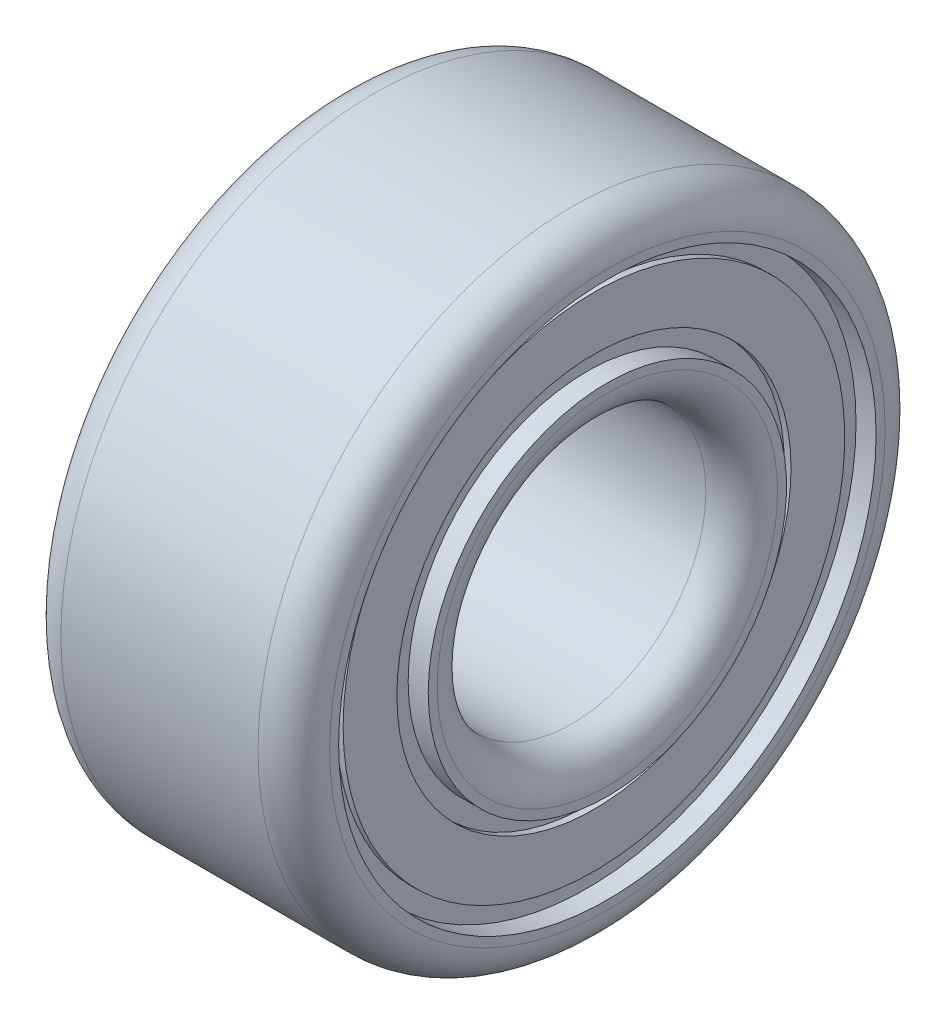
ISO-10303-21;
HEADER;
FILE_DESCRIPTION(('STEP AP214'),'2;1');
FILE_NAME('part.step','',(''),(''),'','','');
FILE_SCHEMA(('AUTOMOTIVE_DESIGN { 1 0 10303 214 1 1 1 1 }'));
ENDSEC;
DATA;
#1=APPLICATION_CONTEXT('core data for automotive mechanical design processes');
#2=APPLICATION_PROTOCOL_DEFINITION('international standard','automotive_design',2000,#1);
#3=PRODUCT_CONTEXT('',#1,'mechanical');
#4=PRODUCT('Part','Part','',(#3));
#5=PRODUCT_RELATED_PRODUCT_CATEGORY('part','',(#4));
#6=PRODUCT_DEFINITION_FORMATION('','',#4);
#7=PRODUCT_DEFINITION_CONTEXT('part definition',#1,'design');
#8=PRODUCT_DEFINITION('design','',#6,#7);
#9=PRODUCT_DEFINITION_SHAPE('','',#8);
#10=(LENGTH_UNIT() NAMED_UNIT(*) SI_UNIT(.MILLI.,.METRE.));
#11=(NAMED_UNIT(*) PLANE_ANGLE_UNIT() SI_UNIT($,.RADIAN.));
#12=(NAMED_UNIT(*) SI_UNIT($,.STERADIAN.) SOLID_ANGLE_UNIT());
#13=UNCERTAINTY_MEASURE_WITH_UNIT(LENGTH_MEASURE(1.E-05),#10,'distance_accuracy_value','');
#14=(GEOMETRIC_REPRESENTATION_CONTEXT(3) GLOBAL_UNCERTAINTY_ASSIGNED_CONTEXT((#13)) GLOBAL_UNIT_ASSIGNED_CONTEXT((#10,
#11,#12)) REPRESENTATION_CONTEXT('',''));
#15=CARTESIAN_POINT('',(0.,0.,0.));
#16=DIRECTION('',(0.,0.,1.));
#17=DIRECTION('',(1.,0.,0.));
#18=AXIS2_PLACEMENT_3D('',#15,#16,#17);
#19=CARTESIAN_POINT('',(-7.41933259282832,0.,0.));
#20=DIRECTION('',(-1.,0.,0.));
#21=DIRECTION('',(0.,0.,1.));
#22=AXIS2_PLACEMENT_3D('',#19,#20,#21);
#23=CYLINDRICAL_SURFACE('',#22,1.5);
#24=CARTESIAN_POINT('',(0.878365864553343,0.,0.));
#25=DIRECTION('',(-1.,0.,0.));
#26=DIRECTION('',(0.,0.,1.));
#27=AXIS2_PLACEMENT_3D('',#24,#25,#26);
#28=CIRCLE('',#27,1.5);
#29=CARTESIAN_POINT('',(0.878365864553343,0.,1.5));
#30=VERTEX_POINT('',#29);
#31=EDGE_CURVE('E507',#30,#30,#28,.T.);
#32=ORIENTED_EDGE('',*,*,#31,.F.);
#33=EDGE_LOOP('',(#32));
#34=FACE_BOUND('',#33,.T.);
#35=CARTESIAN_POINT('',(-1.32163413544666,0.,0.));
#36=DIRECTION('',(1.,0.,0.));
#37=DIRECTION('',(0.,0.,-1.));
#38=AXIS2_PLACEMENT_3D('',#35,#36,#37);
#39=CIRCLE('',#38,1.5);
#40=CARTESIAN_POINT('',(-1.32163413544666,0.,-1.5));
#41=VERTEX_POINT('',#40);
#42=EDGE_CURVE('E64',#41,#41,#39,.T.);
#43=ORIENTED_EDGE('',*,*,#42,.F.);
#44=EDGE_LOOP('',(#43));
#45=FACE_BOUND('',#44,.T.);
#46=ADVANCED_FACE('F17',(#34,#45),#23,.F.);
#47=CARTESIAN_POINT('',(0.878365864553343,0.,0.));
#48=DIRECTION('',(-1.,0.,0.));
#49=DIRECTION('',(0.,0.,1.));
#50=AXIS2_PLACEMENT_3D('',#47,#48,#49);
#51=TOROIDAL_SURFACE('',#50,1.9,0.4);
#52=CARTESIAN_POINT('',(1.27836586455334,0.,0.));
#53=DIRECTION('',(1.,0.,0.));
#54=DIRECTION('',(0.,0.,1.));
#55=AXIS2_PLACEMENT_3D('',#52,#53,#54);
#56=CIRCLE('',#55,1.9);
#57=CARTESIAN_POINT('',(1.27836586455334,0.,1.9));
#58=VERTEX_POINT('',#57);
#59=CARTESIAN_POINT('',(1.27836586455334,0.,-1.9));
#60=VERTEX_POINT('',#59);
#61=EDGE_CURVE('E59',#58,#60,#56,.T.);
#62=ORIENTED_EDGE('',*,*,#61,.T.);
#63=CARTESIAN_POINT('',(1.27836586455334,0.,0.));
#64=DIRECTION('',(1.,0.,0.));
#65=DIRECTION('',(0.,0.,-1.));
#66=AXIS2_PLACEMENT_3D('',#63,#64,#65);
#67=CIRCLE('',#66,1.9);
#68=EDGE_CURVE('E56',#60,#58,#67,.T.);
#69=ORIENTED_EDGE('',*,*,#68,.T.);
#70=EDGE_LOOP('',(#62,#69));
#71=FACE_BOUND('',#70,.T.);
#72=ORIENTED_EDGE('',*,*,#31,.T.);
#73=EDGE_LOOP('',(#72));
#74=FACE_BOUND('',#73,.T.);
#75=ADVANCED_FACE('F60',(#71,#74),#51,.T.);
#76=CARTESIAN_POINT('',(-1.32163413544666,0.,0.));
#77=DIRECTION('',(1.,0.,0.));
#78=DIRECTION('',(0.,0.,-1.));
#79=AXIS2_PLACEMENT_3D('',#76,#77,#78);
#80=TOROIDAL_SURFACE('',#79,1.9,0.4);
#81=CARTESIAN_POINT('',(-1.72163413544666,0.,0.));
#82=DIRECTION('',(-1.,0.,0.));
#83=DIRECTION('',(0.,0.,-1.));
#84=AXIS2_PLACEMENT_3D('',#81,#82,#83);
#85=CIRCLE('',#84,1.9);
#86=CARTESIAN_POINT('',(-1.72163413544666,0.,-1.9));
#87=VERTEX_POINT('',#86);
#88=CARTESIAN_POINT('',(-1.72163413544666,0.,1.9));
#89=VERTEX_POINT('',#88);
#90=EDGE_CURVE('E68',#87,#89,#85,.T.);
#91=ORIENTED_EDGE('',*,*,#90,.T.);
#92=CARTESIAN_POINT('',(-1.72163413544666,0.,0.));
#93=DIRECTION('',(-1.,0.,0.));
#94=DIRECTION('',(0.,0.,1.));
#95=AXIS2_PLACEMENT_3D('',#92,#93,#94);
#96=CIRCLE('',#95,1.9);
#97=EDGE_CURVE('E223',#89,#87,#96,.T.);
#98=ORIENTED_EDGE('',*,*,#97,.T.);
#99=EDGE_LOOP('',(#91,#98));
#100=FACE_BOUND('',#99,.T.);
#101=ORIENTED_EDGE('',*,*,#42,.T.);
#102=EDGE_LOOP('',(#101));
#103=FACE_BOUND('',#102,.T.);
#104=ADVANCED_FACE('F89',(#100,#103),#80,.T.);
#105=CARTESIAN_POINT('',(1.27836586455334,2.,0.));
#106=DIRECTION('',(-1.,0.,0.));
#107=DIRECTION('',(0.,0.,1.));
#108=AXIS2_PLACEMENT_3D('',#105,#106,#107);
#109=PLANE('',#108);
#110=CARTESIAN_POINT('',(1.27836586455334,0.,0.));
#111=DIRECTION('',(-1.,0.,0.));
#112=DIRECTION('',(0.,0.,1.));
#113=AXIS2_PLACEMENT_3D('',#110,#111,#112);
#114=CIRCLE('',#113,2.);
#115=CARTESIAN_POINT('',(1.27836586455334,0.,2.));
#116=VERTEX_POINT('',#115);
#117=EDGE_CURVE('E231',#116,#116,#114,.T.);
#118=ORIENTED_EDGE('',*,*,#117,.F.);
#119=EDGE_LOOP('',(#118));
#120=FACE_BOUND('',#119,.T.);
#121=ORIENTED_EDGE('',*,*,#61,.F.);
#122=ORIENTED_EDGE('',*,*,#68,.F.);
#123=EDGE_LOOP('',(#121,#122));
#124=FACE_BOUND('',#123,.T.);
#125=ADVANCED_FACE('F67',(#120,#124),#109,.F.);
#126=CARTESIAN_POINT('',(-1.72163413544666,1.5,0.));
#127=DIRECTION('',(1.,0.,0.));
#128=DIRECTION('',(0.,0.,-1.));
#129=AXIS2_PLACEMENT_3D('',#126,#127,#128);
#130=PLANE('',#129);
#131=CARTESIAN_POINT('',(-1.72163413544666,0.,0.));
#132=DIRECTION('',(-1.,0.,0.));
#133=DIRECTION('',(0.,0.,1.));
#134=AXIS2_PLACEMENT_3D('',#131,#132,#133);
#135=CIRCLE('',#134,2.);
#136=CARTESIAN_POINT('',(-1.72163413544666,0.,2.));
#137=VERTEX_POINT('',#136);
#138=EDGE_CURVE('E233',#137,#137,#135,.F.);
#139=ORIENTED_EDGE('',*,*,#138,.F.);
#140=EDGE_LOOP('',(#139));
#141=FACE_BOUND('',#140,.T.);
#142=ORIENTED_EDGE('',*,*,#90,.F.);
#143=ORIENTED_EDGE('',*,*,#97,.F.);
#144=EDGE_LOOP('',(#142,#143));
#145=FACE_BOUND('',#144,.T.);
#146=ADVANCED_FACE('F88',(#141,#145),#130,.F.);
#147=CARTESIAN_POINT('',(-7.41933259282832,0.,0.));
#148=DIRECTION('',(-1.,0.,0.));
#149=DIRECTION('',(0.,0.,1.));
#150=AXIS2_PLACEMENT_3D('',#147,#148,#149);
#151=CYLINDRICAL_SURFACE('',#150,2.);
#152=CARTESIAN_POINT('',(1.05443869066034,0.,0.));
#153=DIRECTION('',(-1.,0.,0.));
#154=DIRECTION('',(0.,0.,1.));
#155=AXIS2_PLACEMENT_3D('',#152,#153,#154);
#156=CIRCLE('',#155,2.);
#157=CARTESIAN_POINT('',(1.05443869066034,0.,2.));
#158=VERTEX_POINT('',#157);
#159=EDGE_CURVE('E238',#158,#158,#156,.F.);
#160=ORIENTED_EDGE('',*,*,#159,.T.);
#161=EDGE_LOOP('',(#160));
#162=FACE_BOUND('',#161,.T.);
#163=ORIENTED_EDGE('',*,*,#117,.T.);
#164=EDGE_LOOP('',(#163));
#165=FACE_BOUND('',#164,.T.);
#166=ADVANCED_FACE('F294',(#162,#165),#151,.T.);
#167=CARTESIAN_POINT('',(-7.41933259282832,0.,0.));
#168=DIRECTION('',(-1.,0.,0.));
#169=DIRECTION('',(0.,0.,1.));
#170=AXIS2_PLACEMENT_3D('',#167,#168,#169);
#171=CYLINDRICAL_SURFACE('',#170,2.);
#172=ORIENTED_EDGE('',*,*,#138,.T.);
#173=EDGE_LOOP('',(#172));
#174=FACE_BOUND('',#173,.T.);
#175=CARTESIAN_POINT('',(-1.49770696155366,0.,0.));
#176=DIRECTION('',(-1.,0.,0.));
#177=DIRECTION('',(0.,0.,1.));
#178=AXIS2_PLACEMENT_3D('',#175,#176,#177);
#179=CIRCLE('',#178,2.);
#180=CARTESIAN_POINT('',(-1.49770696155366,0.,2.));
#181=VERTEX_POINT('',#180);
#182=EDGE_CURVE('E289',#181,#181,#179,.T.);
#183=ORIENTED_EDGE('',*,*,#182,.T.);
#184=EDGE_LOOP('',(#183));
#185=FACE_BOUND('',#184,.T.);
#186=ADVANCED_FACE('F300',(#174,#185),#171,.T.);
#187=CARTESIAN_POINT('',(1.05443869066034,2.2,0.));
#188=DIRECTION('',(-1.,0.,0.));
#189=DIRECTION('',(0.,0.,1.));
#190=AXIS2_PLACEMENT_3D('',#187,#188,#189);
#191=PLANE('',#190);
#192=ORIENTED_EDGE('',*,*,#159,.F.);
#193=EDGE_LOOP('',(#192));
#194=FACE_BOUND('',#193,.T.);
#195=CARTESIAN_POINT('',(1.05443869066034,0.,0.));
#196=DIRECTION('',(-1.,0.,0.));
#197=DIRECTION('',(0.,0.,1.));
#198=AXIS2_PLACEMENT_3D('',#195,#196,#197);
#199=CIRCLE('',#198,2.2);
#200=CARTESIAN_POINT('',(1.05443869066034,0.,2.2));
#201=VERTEX_POINT('',#200);
#202=EDGE_CURVE('E286',#201,#201,#199,.F.);
#203=ORIENTED_EDGE('',*,*,#202,.T.);
#204=EDGE_LOOP('',(#203));
#205=FACE_BOUND('',#204,.T.);
#206=ADVANCED_FACE('F296',(#194,#205),#191,.F.);
#207=CARTESIAN_POINT('',(-1.49770696155366,2.,0.));
#208=DIRECTION('',(1.,0.,0.));
#209=DIRECTION('',(0.,0.,-1.));
#210=AXIS2_PLACEMENT_3D('',#207,#208,#209);
#211=PLANE('',#210);
#212=CARTESIAN_POINT('',(-1.49770696155366,0.,0.));
#213=DIRECTION('',(-1.,0.,0.));
#214=DIRECTION('',(0.,0.,1.));
#215=AXIS2_PLACEMENT_3D('',#212,#213,#214);
#216=CIRCLE('',#215,2.2);
#217=CARTESIAN_POINT('',(-1.49770696155366,0.,2.2));
#218=VERTEX_POINT('',#217);
#219=EDGE_CURVE('E283',#218,#218,#216,.T.);
#220=ORIENTED_EDGE('',*,*,#219,.T.);
#221=EDGE_LOOP('',(#220));
#222=FACE_BOUND('',#221,.T.);
#223=ORIENTED_EDGE('',*,*,#182,.F.);
#224=EDGE_LOOP('',(#223));
#225=FACE_BOUND('',#224,.T.);
#226=ADVANCED_FACE('F299',(#222,#225),#211,.F.);
#227=CARTESIAN_POINT('',(-7.41933259282832,0.,0.));
#228=DIRECTION('',(-1.,0.,0.));
#229=DIRECTION('',(0.,0.,1.));
#230=AXIS2_PLACEMENT_3D('',#227,#228,#229);
#231=CYLINDRICAL_SURFACE('',#230,2.2);
#232=CARTESIAN_POINT('',(1.12836586455334,0.,0.));
#233=DIRECTION('',(-1.,0.,0.));
#234=DIRECTION('',(0.,0.,1.));
#235=AXIS2_PLACEMENT_3D('',#232,#233,#234);
#236=CIRCLE('',#235,2.2);
#237=CARTESIAN_POINT('',(1.12836586455334,0.,2.2));
#238=VERTEX_POINT('',#237);
#239=EDGE_CURVE('E280',#238,#238,#236,.F.);
#240=ORIENTED_EDGE('',*,*,#239,.T.);
#241=EDGE_LOOP('',(#240));
#242=FACE_BOUND('',#241,.T.);
#243=ORIENTED_EDGE('',*,*,#202,.F.);
#244=EDGE_LOOP('',(#243));
#245=FACE_BOUND('',#244,.T.);
#246=ADVANCED_FACE('F304',(#242,#245),#231,.F.);
#247=CARTESIAN_POINT('',(-7.41933259282832,0.,0.));
#248=DIRECTION('',(-1.,0.,0.));
#249=DIRECTION('',(0.,0.,1.));
#250=AXIS2_PLACEMENT_3D('',#247,#248,#249);
#251=CYLINDRICAL_SURFACE('',#250,2.2);
#252=ORIENTED_EDGE('',*,*,#219,.F.);
#253=EDGE_LOOP('',(#252));
#254=FACE_BOUND('',#253,.T.);
#255=CARTESIAN_POINT('',(-1.57163413544666,0.,0.));
#256=DIRECTION('',(-1.,0.,0.));
#257=DIRECTION('',(0.,0.,1.));
#258=AXIS2_PLACEMENT_3D('',#255,#256,#257);
#259=CIRCLE('',#258,2.2);
#260=CARTESIAN_POINT('',(-1.57163413544666,0.,2.2));
#261=VERTEX_POINT('',#260);
#262=EDGE_CURVE('E277',#261,#261,#259,.T.);
#263=ORIENTED_EDGE('',*,*,#262,.T.);
#264=EDGE_LOOP('',(#263));
#265=FACE_BOUND('',#264,.T.);
#266=ADVANCED_FACE('F306',(#254,#265),#251,.F.);
#267=CARTESIAN_POINT('',(1.12836586455334,2.8,0.));
#268=DIRECTION('',(-1.,0.,0.));
#269=DIRECTION('',(0.,0.,1.));
#270=AXIS2_PLACEMENT_3D('',#267,#268,#269);
#271=PLANE('',#270);
#272=ORIENTED_EDGE('',*,*,#239,.F.);
#273=EDGE_LOOP('',(#272));
#274=FACE_BOUND('',#273,.T.);
#275=CARTESIAN_POINT('',(1.12836586455334,0.,0.));
#276=DIRECTION('',(-1.,0.,0.));
#277=DIRECTION('',(0.,0.,1.));
#278=AXIS2_PLACEMENT_3D('',#275,#276,#277);
#279=CIRCLE('',#278,2.8);
#280=CARTESIAN_POINT('',(1.12836586455334,0.,2.8));
#281=VERTEX_POINT('',#280);
#282=EDGE_CURVE('E274',#281,#281,#279,.T.);
#283=ORIENTED_EDGE('',*,*,#282,.F.);
#284=EDGE_LOOP('',(#283));
#285=FACE_BOUND('',#284,.T.);
#286=ADVANCED_FACE('F314',(#274,#285),#271,.F.);
#287=CARTESIAN_POINT('',(-1.57163413544666,2.8,0.));
#288=DIRECTION('',(1.,0.,0.));
#289=DIRECTION('',(0.,0.,-1.));
#290=AXIS2_PLACEMENT_3D('',#287,#288,#289);
#291=PLANE('',#290);
#292=CARTESIAN_POINT('',(-1.57163413544666,0.,0.));
#293=DIRECTION('',(-1.,0.,0.));
#294=DIRECTION('',(0.,0.,1.));
#295=AXIS2_PLACEMENT_3D('',#292,#293,#294);
#296=CIRCLE('',#295,2.8);
#297=CARTESIAN_POINT('',(-1.57163413544666,0.,2.8));
#298=VERTEX_POINT('',#297);
#299=EDGE_CURVE('E271',#298,#298,#296,.F.);
#300=ORIENTED_EDGE('',*,*,#299,.F.);
#301=EDGE_LOOP('',(#300));
#302=FACE_BOUND('',#301,.T.);
#303=ORIENTED_EDGE('',*,*,#262,.F.);
#304=EDGE_LOOP('',(#303));
#305=FACE_BOUND('',#304,.T.);
#306=ADVANCED_FACE('F413',(#302,#305),#291,.F.);
#307=CARTESIAN_POINT('',(-7.41933259282832,0.,0.));
#308=DIRECTION('',(-1.,0.,0.));
#309=DIRECTION('',(0.,0.,1.));
#310=AXIS2_PLACEMENT_3D('',#307,#308,#309);
#311=CYLINDRICAL_SURFACE('',#310,2.8);
#312=CARTESIAN_POINT('',(1.05443869066034,0.,0.));
#313=DIRECTION('',(-1.,0.,0.));
#314=DIRECTION('',(0.,0.,1.));
#315=AXIS2_PLACEMENT_3D('',#312,#313,#314);
#316=CIRCLE('',#315,2.8);
#317=CARTESIAN_POINT('',(1.05443869066034,0.,2.8));
#318=VERTEX_POINT('',#317);
#319=EDGE_CURVE('E268',#318,#318,#316,.F.);
#320=ORIENTED_EDGE('',*,*,#319,.T.);
#321=EDGE_LOOP('',(#320));
#322=FACE_BOUND('',#321,.T.);
#323=ORIENTED_EDGE('',*,*,#282,.T.);
#324=EDGE_LOOP('',(#323));
#325=FACE_BOUND('',#324,.T.);
#326=ADVANCED_FACE('F404',(#322,#325),#311,.T.);
#327=CARTESIAN_POINT('',(-7.41933259282832,0.,0.));
#328=DIRECTION('',(-1.,0.,0.));
#329=DIRECTION('',(0.,0.,1.));
#330=AXIS2_PLACEMENT_3D('',#327,#328,#329);
#331=CYLINDRICAL_SURFACE('',#330,2.8);
#332=ORIENTED_EDGE('',*,*,#299,.T.);
#333=EDGE_LOOP('',(#332));
#334=FACE_BOUND('',#333,.T.);
#335=CARTESIAN_POINT('',(-1.49770696155366,0.,0.));
#336=DIRECTION('',(-1.,0.,0.));
#337=DIRECTION('',(0.,0.,1.));
#338=AXIS2_PLACEMENT_3D('',#335,#336,#337);
#339=CIRCLE('',#338,2.8);
#340=CARTESIAN_POINT('',(-1.49770696155366,0.,2.8));
#341=VERTEX_POINT('',#340);
#342=EDGE_CURVE('E265',#341,#341,#339,.T.);
#343=ORIENTED_EDGE('',*,*,#342,.T.);
#344=EDGE_LOOP('',(#343));
#345=FACE_BOUND('',#344,.T.);
#346=ADVANCED_FACE('F395',(#334,#345),#331,.T.);
#347=CARTESIAN_POINT('',(1.05443869066034,3.,0.));
#348=DIRECTION('',(-1.,0.,0.));
#349=DIRECTION('',(0.,0.,1.));
#350=AXIS2_PLACEMENT_3D('',#347,#348,#349);
#351=PLANE('',#350);
#352=ORIENTED_EDGE('',*,*,#319,.F.);
#353=EDGE_LOOP('',(#352));
#354=FACE_BOUND('',#353,.T.);
#355=CARTESIAN_POINT('',(1.05443869066034,0.,0.));
#356=DIRECTION('',(-1.,0.,0.));
#357=DIRECTION('',(0.,0.,1.));
#358=AXIS2_PLACEMENT_3D('',#355,#356,#357);
#359=CIRCLE('',#358,3.);
#360=CARTESIAN_POINT('',(1.05443869066034,0.,3.));
#361=VERTEX_POINT('',#360);
#362=EDGE_CURVE('E258',#361,#361,#359,.F.);
#363=ORIENTED_EDGE('',*,*,#362,.T.);
#364=EDGE_LOOP('',(#363));
#365=FACE_BOUND('',#364,.T.);
#366=ADVANCED_FACE('F386',(#354,#365),#351,.F.);
#367=CARTESIAN_POINT('',(-1.49770696155366,2.8,0.));
#368=DIRECTION('',(1.,0.,0.));
#369=DIRECTION('',(0.,0.,-1.));
#370=AXIS2_PLACEMENT_3D('',#367,#368,#369);
#371=PLANE('',#370);
#372=CARTESIAN_POINT('',(-1.49770696155366,0.,0.));
#373=DIRECTION('',(-1.,0.,0.));
#374=DIRECTION('',(0.,0.,1.));
#375=AXIS2_PLACEMENT_3D('',#372,#373,#374);
#376=CIRCLE('',#375,3.);
#377=CARTESIAN_POINT('',(-1.49770696155366,0.,3.));
#378=VERTEX_POINT('',#377);
#379=EDGE_CURVE('E253',#378,#378,#376,.T.);
#380=ORIENTED_EDGE('',*,*,#379,.T.);
#381=EDGE_LOOP('',(#380));
#382=FACE_BOUND('',#381,.T.);
#383=ORIENTED_EDGE('',*,*,#342,.F.);
#384=EDGE_LOOP('',(#383));
#385=FACE_BOUND('',#384,.T.);
#386=ADVANCED_FACE('F378',(#382,#385),#371,.F.);
#387=CARTESIAN_POINT('',(-7.41933259282832,0.,0.));
#388=DIRECTION('',(-1.,0.,0.));
#389=DIRECTION('',(0.,0.,1.));
#390=AXIS2_PLACEMENT_3D('',#387,#388,#389);
#391=CYLINDRICAL_SURFACE('',#390,3.);
#392=CARTESIAN_POINT('',(1.27836586455334,0.,0.));
#393=DIRECTION('',(-1.,0.,0.));
#394=DIRECTION('',(0.,0.,1.));
#395=AXIS2_PLACEMENT_3D('',#392,#393,#394);
#396=CIRCLE('',#395,3.);
#397=CARTESIAN_POINT('',(1.27836586455334,0.,3.));
#398=VERTEX_POINT('',#397);
#399=EDGE_CURVE('E250',#398,#398,#396,.F.);
#400=ORIENTED_EDGE('',*,*,#399,.T.);
#401=EDGE_LOOP('',(#400));
#402=FACE_BOUND('',#401,.T.);
#403=ORIENTED_EDGE('',*,*,#362,.F.);
#404=EDGE_LOOP('',(#403));
#405=FACE_BOUND('',#404,.T.);
#406=ADVANCED_FACE('F370',(#402,#405),#391,.F.);
#407=CARTESIAN_POINT('',(-7.41933259282832,0.,0.));
#408=DIRECTION('',(-1.,0.,0.));
#409=DIRECTION('',(0.,0.,1.));
#410=AXIS2_PLACEMENT_3D('',#407,#408,#409);
#411=CYLINDRICAL_SURFACE('',#410,3.);
#412=ORIENTED_EDGE('',*,*,#379,.F.);
#413=EDGE_LOOP('',(#412));
#414=FACE_BOUND('',#413,.T.);
#415=CARTESIAN_POINT('',(-1.72163413544666,0.,0.));
#416=DIRECTION('',(-1.,0.,0.));
#417=DIRECTION('',(0.,0.,1.));
#418=AXIS2_PLACEMENT_3D('',#415,#416,#417);
#419=CIRCLE('',#418,3.);
#420=CARTESIAN_POINT('',(-1.72163413544666,0.,3.));
#421=VERTEX_POINT('',#420);
#422=EDGE_CURVE('E251',#421,#421,#419,.T.);
#423=ORIENTED_EDGE('',*,*,#422,.T.);
#424=EDGE_LOOP('',(#423));
#425=FACE_BOUND('',#424,.T.);
#426=ADVANCED_FACE('F362',(#414,#425),#411,.F.);
#427=CARTESIAN_POINT('',(1.27836586455334,3.5,0.));
#428=DIRECTION('',(-1.,0.,0.));
#429=DIRECTION('',(0.,0.,1.));
#430=AXIS2_PLACEMENT_3D('',#427,#428,#429);
#431=PLANE('',#430);
#432=ORIENTED_EDGE('',*,*,#399,.F.);
#433=EDGE_LOOP('',(#432));
#434=FACE_BOUND('',#433,.T.);
#435=CARTESIAN_POINT('',(1.27836586455334,0.,0.));
#436=DIRECTION('',(-1.,0.,0.));
#437=DIRECTION('',(0.,0.,1.));
#438=AXIS2_PLACEMENT_3D('',#435,#436,#437);
#439=CIRCLE('',#438,3.1);
#440=CARTESIAN_POINT('',(1.27836586455334,0.,3.1));
#441=VERTEX_POINT('',#440);
#442=CARTESIAN_POINT('',(1.27836586455334,0.,-3.1));
#443=VERTEX_POINT('',#442);
#444=EDGE_CURVE('E180',#441,#443,#439,.T.);
#445=ORIENTED_EDGE('',*,*,#444,.F.);
#446=CARTESIAN_POINT('',(1.27836586455334,0.,0.));
#447=DIRECTION('',(-1.,0.,0.));
#448=DIRECTION('',(0.,0.,-1.));
#449=AXIS2_PLACEMENT_3D('',#446,#447,#448);
#450=CIRCLE('',#449,3.1);
#451=EDGE_CURVE('E191',#443,#441,#450,.T.);
#452=ORIENTED_EDGE('',*,*,#451,.F.);
#453=EDGE_LOOP('',(#445,#452));
#454=FACE_BOUND('',#453,.T.);
#455=ADVANCED_FACE('F154',(#434,#454),#431,.F.);
#456=CARTESIAN_POINT('',(-1.72163413544666,3.,0.));
#457=DIRECTION('',(1.,0.,0.));
#458=DIRECTION('',(0.,0.,-1.));
#459=AXIS2_PLACEMENT_3D('',#456,#457,#458);
#460=PLANE('',#459);
#461=ORIENTED_EDGE('',*,*,#422,.F.);
#462=EDGE_LOOP('',(#461));
#463=FACE_BOUND('',#462,.T.);
#464=CARTESIAN_POINT('',(-1.72163413544666,0.,0.));
#465=DIRECTION('',(1.,0.,0.));
#466=DIRECTION('',(0.,0.,-1.));
#467=AXIS2_PLACEMENT_3D('',#464,#465,#466);
#468=CIRCLE('',#467,3.1);
#469=CARTESIAN_POINT('',(-1.72163413544666,0.,-3.1));
#470=VERTEX_POINT('',#469);
#471=CARTESIAN_POINT('',(-1.72163413544666,0.,3.1));
#472=VERTEX_POINT('',#471);
#473=EDGE_CURVE('E35',#470,#472,#468,.T.);
#474=ORIENTED_EDGE('',*,*,#473,.F.);
#475=CARTESIAN_POINT('',(-1.72163413544666,0.,0.));
#476=DIRECTION('',(1.,0.,0.));
#477=DIRECTION('',(0.,0.,1.));
#478=AXIS2_PLACEMENT_3D('',#475,#476,#477);
#479=CIRCLE('',#478,3.1);
#480=EDGE_CURVE('E168',#472,#470,#479,.T.);
#481=ORIENTED_EDGE('',*,*,#480,.F.);
#482=EDGE_LOOP('',(#474,#481));
#483=FACE_BOUND('',#482,.T.);
#484=ADVANCED_FACE('F145',(#463,#483),#460,.F.);
#485=CARTESIAN_POINT('',(0.878365864553343,0.,0.));
#486=DIRECTION('',(-1.,0.,0.));
#487=DIRECTION('',(0.,0.,1.));
#488=AXIS2_PLACEMENT_3D('',#485,#486,#487);
#489=TOROIDAL_SURFACE('',#488,3.1,0.4);
#490=ORIENTED_EDGE('',*,*,#444,.T.);
#491=ORIENTED_EDGE('',*,*,#451,.T.);
#492=EDGE_LOOP('',(#490,#491));
#493=FACE_BOUND('',#492,.T.);
#494=CARTESIAN_POINT('',(0.878365864553343,0.,0.));
#495=DIRECTION('',(-1.,0.,0.));
#496=DIRECTION('',(0.,0.,1.));
#497=AXIS2_PLACEMENT_3D('',#494,#495,#496);
#498=CIRCLE('',#497,3.5);
#499=CARTESIAN_POINT('',(0.878365864553343,0.,3.5));
#500=VERTEX_POINT('',#499);
#501=EDGE_CURVE('E27',#500,#500,#498,.T.);
#502=ORIENTED_EDGE('',*,*,#501,.F.);
#503=EDGE_LOOP('',(#502));
#504=FACE_BOUND('',#503,.T.);
#505=ADVANCED_FACE('F131',(#493,#504),#489,.T.);
#506=CARTESIAN_POINT('',(-1.32163413544666,0.,0.));
#507=DIRECTION('',(1.,0.,0.));
#508=DIRECTION('',(0.,0.,-1.));
#509=AXIS2_PLACEMENT_3D('',#506,#507,#508);
#510=TOROIDAL_SURFACE('',#509,3.1,0.4);
#511=CARTESIAN_POINT('',(-1.32163413544666,0.,0.));
#512=DIRECTION('',(-1.,0.,0.));
#513=DIRECTION('',(0.,0.,1.));
#514=AXIS2_PLACEMENT_3D('',#511,#512,#513);
#515=CIRCLE('',#514,3.5);
#516=CARTESIAN_POINT('',(-1.32163413544666,0.,3.5));
#517=VERTEX_POINT('',#516);
#518=EDGE_CURVE('E11',#517,#517,#515,.F.);
#519=ORIENTED_EDGE('',*,*,#518,.F.);
#520=EDGE_LOOP('',(#519));
#521=FACE_BOUND('',#520,.T.);
#522=ORIENTED_EDGE('',*,*,#480,.T.);
#523=ORIENTED_EDGE('',*,*,#473,.T.);
#524=EDGE_LOOP('',(#522,#523));
#525=FACE_BOUND('',#524,.T.);
#526=ADVANCED_FACE('F119',(#521,#525),#510,.T.);
#527=CARTESIAN_POINT('',(-7.41933259282832,0.,0.));
#528=DIRECTION('',(-1.,0.,0.));
#529=DIRECTION('',(0.,0.,1.));
#530=AXIS2_PLACEMENT_3D('',#527,#528,#529);
#531=CYLINDRICAL_SURFACE('',#530,3.5);
#532=ORIENTED_EDGE('',*,*,#501,.T.);
#533=EDGE_LOOP('',(#532));
#534=FACE_BOUND('',#533,.T.);
#535=ORIENTED_EDGE('',*,*,#518,.T.);
#536=EDGE_LOOP('',(#535));
#537=FACE_BOUND('',#536,.T.);
#538=ADVANCED_FACE('F130',(#534,#537),#531,.T.);
#539=CLOSED_SHELL('',(#46,#75,#104,#125,#146,#166,#186,#206,#226,#246,#266,#286,#306,#326,#346,
#366,#386,#406,#426,#455,#484,#505,#526,#538));
#540=MANIFOLD_SOLID_BREP('B1',#539);
#541=ADVANCED_BREP_SHAPE_REPRESENTATION('',(#18,#540),#14);
#542=SHAPE_DEFINITION_REPRESENTATION(#9,#541);
ENDSEC;
END-ISO-10303-21;
